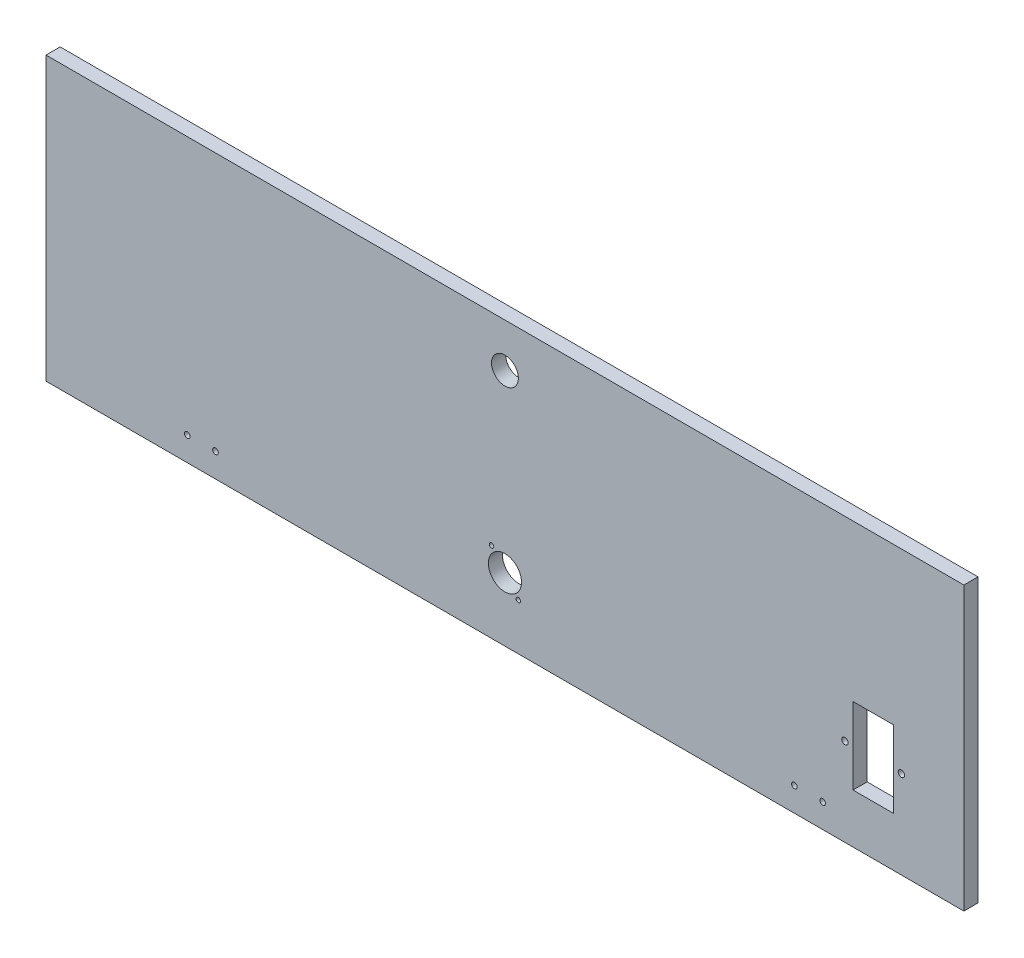
ISO-10303-21;
HEADER;
FILE_DESCRIPTION(('STEP AP214'),'2;1');
FILE_NAME('part.step','',(''),(''),'','','');
FILE_SCHEMA(('AUTOMOTIVE_DESIGN { 1 0 10303 214 1 1 1 1 }'));
ENDSEC;
DATA;
#1=APPLICATION_CONTEXT('core data for automotive mechanical design processes');
#2=APPLICATION_PROTOCOL_DEFINITION('international standard','automotive_design',2000,#1);
#3=PRODUCT_CONTEXT('',#1,'mechanical');
#4=PRODUCT('Part','Part','',(#3));
#5=PRODUCT_RELATED_PRODUCT_CATEGORY('part','',(#4));
#6=PRODUCT_DEFINITION_FORMATION('','',#4);
#7=PRODUCT_DEFINITION_CONTEXT('part definition',#1,'design');
#8=PRODUCT_DEFINITION('design','',#6,#7);
#9=PRODUCT_DEFINITION_SHAPE('','',#8);
#10=(LENGTH_UNIT() NAMED_UNIT(*) SI_UNIT(.MILLI.,.METRE.));
#11=(NAMED_UNIT(*) PLANE_ANGLE_UNIT() SI_UNIT($,.RADIAN.));
#12=(NAMED_UNIT(*) SI_UNIT($,.STERADIAN.) SOLID_ANGLE_UNIT());
#13=UNCERTAINTY_MEASURE_WITH_UNIT(LENGTH_MEASURE(1.E-05),#10,'distance_accuracy_value','');
#14=(GEOMETRIC_REPRESENTATION_CONTEXT(3) GLOBAL_UNCERTAINTY_ASSIGNED_CONTEXT((#13)) GLOBAL_UNIT_ASSIGNED_CONTEXT((#10,
#11,#12)) REPRESENTATION_CONTEXT('',''));
#15=CARTESIAN_POINT('',(0.,0.,0.));
#16=DIRECTION('',(0.,0.,1.));
#17=DIRECTION('',(1.,0.,0.));
#18=AXIS2_PLACEMENT_3D('',#15,#16,#17);
#19=CARTESIAN_POINT('',(0.,0.,10.));
#20=DIRECTION('',(1.,0.,0.));
#21=DIRECTION('',(0.,0.,-1.));
#22=AXIS2_PLACEMENT_3D('',#19,#20,#21);
#23=PLANE('',#22);
#24=DIRECTION('',(0.,-1.,0.));
#25=VECTOR('',#24,1.);
#26=CARTESIAN_POINT('',(0.,0.,0.));
#27=LINE('',#26,#25);
#28=CARTESIAN_POINT('',(0.,200.,0.));
#29=VERTEX_POINT('',#28);
#30=CARTESIAN_POINT('',(0.,0.,0.));
#31=VERTEX_POINT('',#30);
#32=EDGE_CURVE('E177',#29,#31,#27,.T.);
#33=ORIENTED_EDGE('',*,*,#32,.T.);
#34=DIRECTION('',(0.,0.,-1.));
#35=VECTOR('',#34,1.);
#36=CARTESIAN_POINT('',(0.,0.,10.));
#37=LINE('',#36,#35);
#38=CARTESIAN_POINT('',(0.,0.,10.));
#39=VERTEX_POINT('',#38);
#40=EDGE_CURVE('E12',#39,#31,#37,.T.);
#41=ORIENTED_EDGE('',*,*,#40,.F.);
#42=DIRECTION('',(0.,-1.,0.));
#43=VECTOR('',#42,1.);
#44=CARTESIAN_POINT('',(0.,0.,10.));
#45=LINE('',#44,#43);
#46=CARTESIAN_POINT('',(0.,200.,10.));
#47=VERTEX_POINT('',#46);
#48=EDGE_CURVE('E180',#47,#39,#45,.T.);
#49=ORIENTED_EDGE('',*,*,#48,.F.);
#50=DIRECTION('',(0.,0.,-1.));
#51=VECTOR('',#50,1.);
#52=CARTESIAN_POINT('',(0.,200.,10.));
#53=LINE('',#52,#51);
#54=EDGE_CURVE('E190',#47,#29,#53,.T.);
#55=ORIENTED_EDGE('',*,*,#54,.T.);
#56=EDGE_LOOP('',(#33,#41,#49,#55));
#57=FACE_BOUND('',#56,.T.);
#58=ADVANCED_FACE('F45',(#57),#23,.F.);
#59=CARTESIAN_POINT('',(0.,0.,10.));
#60=DIRECTION('',(0.,1.,0.));
#61=DIRECTION('',(0.,0.,1.));
#62=AXIS2_PLACEMENT_3D('',#59,#60,#61);
#63=PLANE('',#62);
#64=DIRECTION('',(1.,0.,0.));
#65=VECTOR('',#64,1.);
#66=CARTESIAN_POINT('',(0.,0.,0.));
#67=LINE('',#66,#65);
#68=CARTESIAN_POINT('',(650.,0.,0.));
#69=VERTEX_POINT('',#68);
#70=EDGE_CURVE('E193',#31,#69,#67,.T.);
#71=ORIENTED_EDGE('',*,*,#70,.T.);
#72=DIRECTION('',(0.,0.,-1.));
#73=VECTOR('',#72,1.);
#74=CARTESIAN_POINT('',(650.,0.,10.));
#75=LINE('',#74,#73);
#76=CARTESIAN_POINT('',(650.,0.,10.));
#77=VERTEX_POINT('',#76);
#78=EDGE_CURVE('E52',#77,#69,#75,.T.);
#79=ORIENTED_EDGE('',*,*,#78,.F.);
#80=DIRECTION('',(1.,0.,0.));
#81=VECTOR('',#80,1.);
#82=CARTESIAN_POINT('',(0.,0.,10.));
#83=LINE('',#82,#81);
#84=EDGE_CURVE('E183',#39,#77,#83,.T.);
#85=ORIENTED_EDGE('',*,*,#84,.F.);
#86=ORIENTED_EDGE('',*,*,#40,.T.);
#87=EDGE_LOOP('',(#71,#79,#85,#86));
#88=FACE_BOUND('',#87,.T.);
#89=ADVANCED_FACE('F222',(#88),#63,.F.);
#90=CARTESIAN_POINT('',(650.,0.,10.));
#91=DIRECTION('',(-1.,0.,0.));
#92=DIRECTION('',(0.,0.,1.));
#93=AXIS2_PLACEMENT_3D('',#90,#91,#92);
#94=PLANE('',#93);
#95=DIRECTION('',(0.,1.,0.));
#96=VECTOR('',#95,1.);
#97=CARTESIAN_POINT('',(650.,0.,0.));
#98=LINE('',#97,#96);
#99=CARTESIAN_POINT('',(650.,200.,0.));
#100=VERTEX_POINT('',#99);
#101=EDGE_CURVE('E195',#69,#100,#98,.T.);
#102=ORIENTED_EDGE('',*,*,#101,.T.);
#103=DIRECTION('',(0.,0.,-1.));
#104=VECTOR('',#103,1.);
#105=CARTESIAN_POINT('',(650.,200.,10.));
#106=LINE('',#105,#104);
#107=CARTESIAN_POINT('',(650.,200.,10.));
#108=VERTEX_POINT('',#107);
#109=EDGE_CURVE('E200',#108,#100,#106,.T.);
#110=ORIENTED_EDGE('',*,*,#109,.F.);
#111=DIRECTION('',(0.,1.,0.));
#112=VECTOR('',#111,1.);
#113=CARTESIAN_POINT('',(650.,0.,10.));
#114=LINE('',#113,#112);
#115=EDGE_CURVE('E186',#77,#108,#114,.T.);
#116=ORIENTED_EDGE('',*,*,#115,.F.);
#117=ORIENTED_EDGE('',*,*,#78,.T.);
#118=EDGE_LOOP('',(#102,#110,#116,#117));
#119=FACE_BOUND('',#118,.T.);
#120=ADVANCED_FACE('F207',(#119),#94,.F.);
#121=CARTESIAN_POINT('',(0.,200.,10.));
#122=DIRECTION('',(0.,-1.,0.));
#123=DIRECTION('',(0.,0.,-1.));
#124=AXIS2_PLACEMENT_3D('',#121,#122,#123);
#125=PLANE('',#124);
#126=DIRECTION('',(-1.,0.,0.));
#127=VECTOR('',#126,1.);
#128=CARTESIAN_POINT('',(0.,200.,0.));
#129=LINE('',#128,#127);
#130=EDGE_CURVE('E184',#100,#29,#129,.T.);
#131=ORIENTED_EDGE('',*,*,#130,.T.);
#132=ORIENTED_EDGE('',*,*,#54,.F.);
#133=DIRECTION('',(-1.,0.,0.));
#134=VECTOR('',#133,1.);
#135=CARTESIAN_POINT('',(0.,200.,10.));
#136=LINE('',#135,#134);
#137=EDGE_CURVE('E188',#108,#47,#136,.T.);
#138=ORIENTED_EDGE('',*,*,#137,.F.);
#139=ORIENTED_EDGE('',*,*,#109,.T.);
#140=EDGE_LOOP('',(#131,#132,#138,#139));
#141=FACE_BOUND('',#140,.T.);
#142=ADVANCED_FACE('F216',(#141),#125,.F.);
#143=CARTESIAN_POINT('',(0.,0.,10.));
#144=DIRECTION('',(0.,0.,-1.));
#145=DIRECTION('',(-1.,0.,0.));
#146=AXIS2_PLACEMENT_3D('',#143,#144,#145);
#147=PLANE('',#146);
#148=CARTESIAN_POINT('',(325.,169.,10.));
#149=DIRECTION('',(0.,0.,1.));
#150=DIRECTION('',(1.,0.,0.));
#151=AXIS2_PLACEMENT_3D('',#148,#149,#150);
#152=CIRCLE('',#151,9.50000000000001);
#153=CARTESIAN_POINT('',(334.5,169.,10.));
#154=VERTEX_POINT('',#153);
#155=EDGE_CURVE('E374',#154,#154,#152,.T.);
#156=ORIENTED_EDGE('',*,*,#155,.F.);
#157=EDGE_LOOP('',(#156));
#158=FACE_BOUND('',#157,.T.);
#159=CARTESIAN_POINT('',(315.499614793712,56.9994043990588,10.));
#160=DIRECTION('',(0.,0.,1.));
#161=DIRECTION('',(1.,0.,0.));
#162=AXIS2_PLACEMENT_3D('',#159,#160,#161);
#163=CIRCLE('',#162,1.59999999999996);
#164=CARTESIAN_POINT('',(317.099614793712,56.9994043990588,10.));
#165=VERTEX_POINT('',#164);
#166=EDGE_CURVE('E155',#165,#165,#163,.T.);
#167=ORIENTED_EDGE('',*,*,#166,.F.);
#168=EDGE_LOOP('',(#167));
#169=FACE_BOUND('',#168,.T.);
#170=CARTESIAN_POINT('',(334.500385206288,33.0005956009415,10.));
#171=DIRECTION('',(0.,0.,1.));
#172=DIRECTION('',(1.,0.,0.));
#173=AXIS2_PLACEMENT_3D('',#170,#171,#172);
#174=CIRCLE('',#173,1.59999999999982);
#175=CARTESIAN_POINT('',(336.100385206288,33.0005956009415,10.));
#176=VERTEX_POINT('',#175);
#177=EDGE_CURVE('E134',#176,#176,#174,.T.);
#178=ORIENTED_EDGE('',*,*,#177,.F.);
#179=EDGE_LOOP('',(#178));
#180=FACE_BOUND('',#179,.T.);
#181=CARTESIAN_POINT('',(605.75,62.15,10.));
#182=DIRECTION('',(0.,0.,1.));
#183=DIRECTION('',(1.,0.,0.));
#184=AXIS2_PLACEMENT_3D('',#181,#182,#183);
#185=CIRCLE('',#184,2.25000000000001);
#186=CARTESIAN_POINT('',(608.,62.15,10.));
#187=VERTEX_POINT('',#186);
#188=EDGE_CURVE('E395',#187,#187,#185,.T.);
#189=ORIENTED_EDGE('',*,*,#188,.F.);
#190=EDGE_LOOP('',(#189));
#191=FACE_BOUND('',#190,.T.);
#192=CARTESIAN_POINT('',(565.75,62.15,10.));
#193=DIRECTION('',(0.,0.,1.));
#194=DIRECTION('',(1.,0.,0.));
#195=AXIS2_PLACEMENT_3D('',#192,#193,#194);
#196=CIRCLE('',#195,2.25000000000001);
#197=CARTESIAN_POINT('',(568.,62.15,10.));
#198=VERTEX_POINT('',#197);
#199=EDGE_CURVE('E116',#198,#198,#196,.T.);
#200=ORIENTED_EDGE('',*,*,#199,.F.);
#201=EDGE_LOOP('',(#200));
#202=FACE_BOUND('',#201,.T.);
#203=DIRECTION('',(0.,1.,0.));
#204=VECTOR('',#203,1.);
#205=CARTESIAN_POINT('',(600.,0.,10.));
#206=LINE('',#205,#204);
#207=CARTESIAN_POINT('',(600.,35.,10.));
#208=VERTEX_POINT('',#207);
#209=CARTESIAN_POINT('',(600.,89.3,10.));
#210=VERTEX_POINT('',#209);
#211=EDGE_CURVE('E130',#208,#210,#206,.T.);
#212=ORIENTED_EDGE('',*,*,#211,.F.);
#213=DIRECTION('',(1.,0.,0.));
#214=VECTOR('',#213,1.);
#215=CARTESIAN_POINT('',(0.,35.,10.));
#216=LINE('',#215,#214);
#217=CARTESIAN_POINT('',(571.5,35.,10.));
#218=VERTEX_POINT('',#217);
#219=EDGE_CURVE('E59',#218,#208,#216,.T.);
#220=ORIENTED_EDGE('',*,*,#219,.F.);
#221=DIRECTION('',(0.,1.,0.));
#222=VECTOR('',#221,1.);
#223=CARTESIAN_POINT('',(571.5,0.,10.));
#224=LINE('',#223,#222);
#225=CARTESIAN_POINT('',(571.5,89.3,10.));
#226=VERTEX_POINT('',#225);
#227=EDGE_CURVE('E119',#218,#226,#224,.T.);
#228=ORIENTED_EDGE('',*,*,#227,.T.);
#229=DIRECTION('',(1.,0.,0.));
#230=VECTOR('',#229,1.);
#231=CARTESIAN_POINT('',(0.,89.3,10.));
#232=LINE('',#231,#230);
#233=EDGE_CURVE('E125',#226,#210,#232,.T.);
#234=ORIENTED_EDGE('',*,*,#233,.T.);
#235=EDGE_LOOP('',(#212,#220,#228,#234));
#236=FACE_BOUND('',#235,.T.);
#237=CARTESIAN_POINT('',(325.,45.,10.));
#238=DIRECTION('',(0.,0.,1.));
#239=DIRECTION('',(1.,0.,0.));
#240=AXIS2_PLACEMENT_3D('',#237,#238,#239);
#241=CIRCLE('',#240,11.75);
#242=CARTESIAN_POINT('',(336.75,45.,10.));
#243=VERTEX_POINT('',#242);
#244=EDGE_CURVE('E152',#243,#243,#241,.T.);
#245=ORIENTED_EDGE('',*,*,#244,.F.);
#246=EDGE_LOOP('',(#245));
#247=FACE_BOUND('',#246,.T.);
#248=CARTESIAN_POINT('',(120.,17.,10.));
#249=DIRECTION('',(0.,0.,1.));
#250=DIRECTION('',(1.,0.,0.));
#251=AXIS2_PLACEMENT_3D('',#248,#249,#250);
#252=CIRCLE('',#251,2.);
#253=CARTESIAN_POINT('',(122.,17.,10.));
#254=VERTEX_POINT('',#253);
#255=EDGE_CURVE('E160',#254,#254,#252,.T.);
#256=ORIENTED_EDGE('',*,*,#255,.F.);
#257=EDGE_LOOP('',(#256));
#258=FACE_BOUND('',#257,.T.);
#259=CARTESIAN_POINT('',(530.,17.,10.));
#260=DIRECTION('',(0.,0.,1.));
#261=DIRECTION('',(1.,0.,0.));
#262=AXIS2_PLACEMENT_3D('',#259,#260,#261);
#263=CIRCLE('',#262,2.);
#264=CARTESIAN_POINT('',(532.,17.,10.));
#265=VERTEX_POINT('',#264);
#266=EDGE_CURVE('E166',#265,#265,#263,.T.);
#267=ORIENTED_EDGE('',*,*,#266,.F.);
#268=EDGE_LOOP('',(#267));
#269=FACE_BOUND('',#268,.T.);
#270=CARTESIAN_POINT('',(550.,17.,10.));
#271=DIRECTION('',(0.,0.,1.));
#272=DIRECTION('',(1.,0.,0.));
#273=AXIS2_PLACEMENT_3D('',#270,#271,#272);
#274=CIRCLE('',#273,2.);
#275=CARTESIAN_POINT('',(552.,17.,10.));
#276=VERTEX_POINT('',#275);
#277=EDGE_CURVE('E151',#276,#276,#274,.T.);
#278=ORIENTED_EDGE('',*,*,#277,.F.);
#279=EDGE_LOOP('',(#278));
#280=FACE_BOUND('',#279,.T.);
#281=CARTESIAN_POINT('',(100.,17.,10.));
#282=DIRECTION('',(0.,0.,1.));
#283=DIRECTION('',(1.,0.,0.));
#284=AXIS2_PLACEMENT_3D('',#281,#282,#283);
#285=CIRCLE('',#284,2.);
#286=CARTESIAN_POINT('',(102.,17.,10.));
#287=VERTEX_POINT('',#286);
#288=EDGE_CURVE('E159',#287,#287,#285,.T.);
#289=ORIENTED_EDGE('',*,*,#288,.F.);
#290=EDGE_LOOP('',(#289));
#291=FACE_BOUND('',#290,.T.);
#292=ORIENTED_EDGE('',*,*,#48,.T.);
#293=ORIENTED_EDGE('',*,*,#84,.T.);
#294=ORIENTED_EDGE('',*,*,#115,.T.);
#295=ORIENTED_EDGE('',*,*,#137,.T.);
#296=EDGE_LOOP('',(#292,#293,#294,#295));
#297=FACE_BOUND('',#296,.T.);
#298=ADVANCED_FACE('F128',(#158,#169,#180,#191,#202,#236,#247,#258,#269,#280,#291,#297),#147,.F.);
#299=CARTESIAN_POINT('',(0.,0.,0.));
#300=DIRECTION('',(0.,0.,-1.));
#301=DIRECTION('',(-1.,0.,0.));
#302=AXIS2_PLACEMENT_3D('',#299,#300,#301);
#303=PLANE('',#302);
#304=CARTESIAN_POINT('',(525.,193.,0.));
#305=DIRECTION('',(0.,0.,1.));
#306=DIRECTION('',(1.,0.,0.));
#307=AXIS2_PLACEMENT_3D('',#304,#305,#306);
#308=CIRCLE('',#307,1.00000000000006);
#309=CARTESIAN_POINT('',(526.,193.,0.));
#310=VERTEX_POINT('',#309);
#311=EDGE_CURVE('E359',#310,#310,#308,.T.);
#312=ORIENTED_EDGE('',*,*,#311,.T.);
#313=EDGE_LOOP('',(#312));
#314=FACE_BOUND('',#313,.T.);
#315=CARTESIAN_POINT('',(545.,193.,0.));
#316=DIRECTION('',(0.,0.,1.));
#317=DIRECTION('',(1.,0.,0.));
#318=AXIS2_PLACEMENT_3D('',#315,#316,#317);
#319=CIRCLE('',#318,1.00000000000005);
#320=CARTESIAN_POINT('',(546.,193.,0.));
#321=VERTEX_POINT('',#320);
#322=EDGE_CURVE('E353',#321,#321,#319,.T.);
#323=ORIENTED_EDGE('',*,*,#322,.T.);
#324=EDGE_LOOP('',(#323));
#325=FACE_BOUND('',#324,.T.);
#326=CARTESIAN_POINT('',(105.,193.,0.));
#327=DIRECTION('',(0.,0.,1.));
#328=DIRECTION('',(1.,0.,0.));
#329=AXIS2_PLACEMENT_3D('',#326,#327,#328);
#330=CIRCLE('',#329,0.999999999999998);
#331=CARTESIAN_POINT('',(106.,193.,0.));
#332=VERTEX_POINT('',#331);
#333=EDGE_CURVE('E342',#332,#332,#330,.T.);
#334=ORIENTED_EDGE('',*,*,#333,.T.);
#335=EDGE_LOOP('',(#334));
#336=FACE_BOUND('',#335,.T.);
#337=CARTESIAN_POINT('',(125.,193.,0.));
#338=DIRECTION('',(0.,0.,1.));
#339=DIRECTION('',(1.,0.,0.));
#340=AXIS2_PLACEMENT_3D('',#337,#338,#339);
#341=CIRCLE('',#340,0.999999999999972);
#342=CARTESIAN_POINT('',(126.,193.,0.));
#343=VERTEX_POINT('',#342);
#344=EDGE_CURVE('E341',#343,#343,#341,.T.);
#345=ORIENTED_EDGE('',*,*,#344,.T.);
#346=EDGE_LOOP('',(#345));
#347=FACE_BOUND('',#346,.T.);
#348=CARTESIAN_POINT('',(309.,169.,0.));
#349=DIRECTION('',(0.,0.,1.));
#350=DIRECTION('',(1.,0.,0.));
#351=AXIS2_PLACEMENT_3D('',#348,#349,#350);
#352=CIRCLE('',#351,0.999999999999998);
#353=CARTESIAN_POINT('',(310.,169.,0.));
#354=VERTEX_POINT('',#353);
#355=EDGE_CURVE('E366',#354,#354,#352,.T.);
#356=ORIENTED_EDGE('',*,*,#355,.T.);
#357=EDGE_LOOP('',(#356));
#358=FACE_BOUND('',#357,.T.);
#359=CARTESIAN_POINT('',(341.,169.,0.));
#360=DIRECTION('',(0.,0.,1.));
#361=DIRECTION('',(1.,0.,0.));
#362=AXIS2_PLACEMENT_3D('',#359,#360,#361);
#363=CIRCLE('',#362,0.999999999999998);
#364=CARTESIAN_POINT('',(342.,169.,0.));
#365=VERTEX_POINT('',#364);
#366=EDGE_CURVE('E365',#365,#365,#363,.T.);
#367=ORIENTED_EDGE('',*,*,#366,.T.);
#368=EDGE_LOOP('',(#367));
#369=FACE_BOUND('',#368,.T.);
#370=CARTESIAN_POINT('',(325.,169.,0.));
#371=DIRECTION('',(0.,0.,1.));
#372=DIRECTION('',(1.,0.,0.));
#373=AXIS2_PLACEMENT_3D('',#370,#371,#372);
#374=CIRCLE('',#373,9.50000000000001);
#375=CARTESIAN_POINT('',(334.5,169.,0.));
#376=VERTEX_POINT('',#375);
#377=EDGE_CURVE('E377',#376,#376,#374,.T.);
#378=ORIENTED_EDGE('',*,*,#377,.T.);
#379=EDGE_LOOP('',(#378));
#380=FACE_BOUND('',#379,.T.);
#381=CARTESIAN_POINT('',(315.499614793712,56.9994043990588,0.));
#382=DIRECTION('',(0.,0.,1.));
#383=DIRECTION('',(1.,0.,0.));
#384=AXIS2_PLACEMENT_3D('',#381,#382,#383);
#385=CIRCLE('',#384,1.59999999999996);
#386=CARTESIAN_POINT('',(317.099614793712,56.9994043990588,0.));
#387=VERTEX_POINT('',#386);
#388=EDGE_CURVE('E385',#387,#387,#385,.T.);
#389=ORIENTED_EDGE('',*,*,#388,.T.);
#390=EDGE_LOOP('',(#389));
#391=FACE_BOUND('',#390,.T.);
#392=CARTESIAN_POINT('',(334.500385206288,33.0005956009415,0.));
#393=DIRECTION('',(0.,0.,1.));
#394=DIRECTION('',(1.,0.,0.));
#395=AXIS2_PLACEMENT_3D('',#392,#393,#394);
#396=CIRCLE('',#395,1.59999999999982);
#397=CARTESIAN_POINT('',(336.100385206288,33.0005956009415,0.));
#398=VERTEX_POINT('',#397);
#399=EDGE_CURVE('E131',#398,#398,#396,.T.);
#400=ORIENTED_EDGE('',*,*,#399,.T.);
#401=EDGE_LOOP('',(#400));
#402=FACE_BOUND('',#401,.T.);
#403=CARTESIAN_POINT('',(605.75,62.15,0.));
#404=DIRECTION('',(0.,0.,1.));
#405=DIRECTION('',(1.,0.,0.));
#406=AXIS2_PLACEMENT_3D('',#403,#404,#405);
#407=CIRCLE('',#406,2.25000000000001);
#408=CARTESIAN_POINT('',(608.,62.15,0.));
#409=VERTEX_POINT('',#408);
#410=EDGE_CURVE('E380',#409,#409,#407,.T.);
#411=ORIENTED_EDGE('',*,*,#410,.T.);
#412=EDGE_LOOP('',(#411));
#413=FACE_BOUND('',#412,.T.);
#414=CARTESIAN_POINT('',(565.75,62.15,0.));
#415=DIRECTION('',(0.,0.,1.));
#416=DIRECTION('',(1.,0.,0.));
#417=AXIS2_PLACEMENT_3D('',#414,#415,#416);
#418=CIRCLE('',#417,2.25000000000001);
#419=CARTESIAN_POINT('',(568.,62.15,0.));
#420=VERTEX_POINT('',#419);
#421=EDGE_CURVE('E392',#420,#420,#418,.T.);
#422=ORIENTED_EDGE('',*,*,#421,.T.);
#423=EDGE_LOOP('',(#422));
#424=FACE_BOUND('',#423,.T.);
#425=DIRECTION('',(1.,0.,0.));
#426=VECTOR('',#425,1.);
#427=CARTESIAN_POINT('',(0.,35.,0.));
#428=LINE('',#427,#426);
#429=CARTESIAN_POINT('',(571.5,35.,0.));
#430=VERTEX_POINT('',#429);
#431=CARTESIAN_POINT('',(600.,35.,0.));
#432=VERTEX_POINT('',#431);
#433=EDGE_CURVE('E112',#430,#432,#428,.T.);
#434=ORIENTED_EDGE('',*,*,#433,.T.);
#435=DIRECTION('',(0.,1.,0.));
#436=VECTOR('',#435,1.);
#437=CARTESIAN_POINT('',(600.,0.,0.));
#438=LINE('',#437,#436);
#439=CARTESIAN_POINT('',(600.,89.3,0.));
#440=VERTEX_POINT('',#439);
#441=EDGE_CURVE('E144',#432,#440,#438,.T.);
#442=ORIENTED_EDGE('',*,*,#441,.T.);
#443=DIRECTION('',(1.,0.,0.));
#444=VECTOR('',#443,1.);
#445=CARTESIAN_POINT('',(0.,89.3,0.));
#446=LINE('',#445,#444);
#447=CARTESIAN_POINT('',(571.5,89.3,0.));
#448=VERTEX_POINT('',#447);
#449=EDGE_CURVE('E141',#448,#440,#446,.T.);
#450=ORIENTED_EDGE('',*,*,#449,.F.);
#451=DIRECTION('',(0.,1.,0.));
#452=VECTOR('',#451,1.);
#453=CARTESIAN_POINT('',(571.5,0.,0.));
#454=LINE('',#453,#452);
#455=EDGE_CURVE('E139',#430,#448,#454,.T.);
#456=ORIENTED_EDGE('',*,*,#455,.F.);
#457=EDGE_LOOP('',(#434,#442,#450,#456));
#458=FACE_BOUND('',#457,.T.);
#459=CARTESIAN_POINT('',(325.,45.,0.));
#460=DIRECTION('',(0.,0.,1.));
#461=DIRECTION('',(1.,0.,0.));
#462=AXIS2_PLACEMENT_3D('',#459,#460,#461);
#463=CIRCLE('',#462,11.75);
#464=CARTESIAN_POINT('',(336.75,45.,0.));
#465=VERTEX_POINT('',#464);
#466=EDGE_CURVE('E148',#465,#465,#463,.T.);
#467=ORIENTED_EDGE('',*,*,#466,.T.);
#468=EDGE_LOOP('',(#467));
#469=FACE_BOUND('',#468,.T.);
#470=CARTESIAN_POINT('',(120.,17.,0.));
#471=DIRECTION('',(0.,0.,1.));
#472=DIRECTION('',(1.,0.,0.));
#473=AXIS2_PLACEMENT_3D('',#470,#471,#472);
#474=CIRCLE('',#473,2.);
#475=CARTESIAN_POINT('',(122.,17.,0.));
#476=VERTEX_POINT('',#475);
#477=EDGE_CURVE('E156',#476,#476,#474,.T.);
#478=ORIENTED_EDGE('',*,*,#477,.T.);
#479=EDGE_LOOP('',(#478));
#480=FACE_BOUND('',#479,.T.);
#481=CARTESIAN_POINT('',(530.,17.,0.));
#482=DIRECTION('',(0.,0.,1.));
#483=DIRECTION('',(1.,0.,0.));
#484=AXIS2_PLACEMENT_3D('',#481,#482,#483);
#485=CIRCLE('',#484,2.);
#486=CARTESIAN_POINT('',(532.,17.,0.));
#487=VERTEX_POINT('',#486);
#488=EDGE_CURVE('E163',#487,#487,#485,.T.);
#489=ORIENTED_EDGE('',*,*,#488,.T.);
#490=EDGE_LOOP('',(#489));
#491=FACE_BOUND('',#490,.T.);
#492=CARTESIAN_POINT('',(550.,17.,0.));
#493=DIRECTION('',(0.,0.,1.));
#494=DIRECTION('',(1.,0.,0.));
#495=AXIS2_PLACEMENT_3D('',#492,#493,#494);
#496=CIRCLE('',#495,2.);
#497=CARTESIAN_POINT('',(552.,17.,0.));
#498=VERTEX_POINT('',#497);
#499=EDGE_CURVE('E169',#498,#498,#496,.T.);
#500=ORIENTED_EDGE('',*,*,#499,.T.);
#501=EDGE_LOOP('',(#500));
#502=FACE_BOUND('',#501,.T.);
#503=CARTESIAN_POINT('',(100.,17.,0.));
#504=DIRECTION('',(0.,0.,1.));
#505=DIRECTION('',(1.,0.,0.));
#506=AXIS2_PLACEMENT_3D('',#503,#504,#505);
#507=CIRCLE('',#506,2.);
#508=CARTESIAN_POINT('',(102.,17.,0.));
#509=VERTEX_POINT('',#508);
#510=EDGE_CURVE('E174',#509,#509,#507,.T.);
#511=ORIENTED_EDGE('',*,*,#510,.T.);
#512=EDGE_LOOP('',(#511));
#513=FACE_BOUND('',#512,.T.);
#514=ORIENTED_EDGE('',*,*,#32,.F.);
#515=ORIENTED_EDGE('',*,*,#130,.F.);
#516=ORIENTED_EDGE('',*,*,#101,.F.);
#517=ORIENTED_EDGE('',*,*,#70,.F.);
#518=EDGE_LOOP('',(#514,#515,#516,#517));
#519=FACE_BOUND('',#518,.T.);
#520=ADVANCED_FACE('F213',(#314,#325,#336,#347,#358,#369,#380,#391,#402,#413,#424,#458,#469,
#480,#491,#502,#513,#519),#303,.T.);
#521=CARTESIAN_POINT('',(100.,17.,0.));
#522=DIRECTION('',(0.,0.,1.));
#523=DIRECTION('',(1.,0.,0.));
#524=AXIS2_PLACEMENT_3D('',#521,#522,#523);
#525=CYLINDRICAL_SURFACE('',#524,2.);
#526=ORIENTED_EDGE('',*,*,#510,.F.);
#527=EDGE_LOOP('',(#526));
#528=FACE_BOUND('',#527,.T.);
#529=ORIENTED_EDGE('',*,*,#288,.T.);
#530=EDGE_LOOP('',(#529));
#531=FACE_BOUND('',#530,.T.);
#532=ADVANCED_FACE('F234',(#528,#531),#525,.F.);
#533=CARTESIAN_POINT('',(550.,17.,0.));
#534=DIRECTION('',(0.,0.,1.));
#535=DIRECTION('',(1.,0.,0.));
#536=AXIS2_PLACEMENT_3D('',#533,#534,#535);
#537=CYLINDRICAL_SURFACE('',#536,2.);
#538=ORIENTED_EDGE('',*,*,#499,.F.);
#539=EDGE_LOOP('',(#538));
#540=FACE_BOUND('',#539,.T.);
#541=ORIENTED_EDGE('',*,*,#277,.T.);
#542=EDGE_LOOP('',(#541));
#543=FACE_BOUND('',#542,.T.);
#544=ADVANCED_FACE('F241',(#540,#543),#537,.F.);
#545=CARTESIAN_POINT('',(530.,17.,0.));
#546=DIRECTION('',(0.,0.,1.));
#547=DIRECTION('',(1.,0.,0.));
#548=AXIS2_PLACEMENT_3D('',#545,#546,#547);
#549=CYLINDRICAL_SURFACE('',#548,2.);
#550=ORIENTED_EDGE('',*,*,#488,.F.);
#551=EDGE_LOOP('',(#550));
#552=FACE_BOUND('',#551,.T.);
#553=ORIENTED_EDGE('',*,*,#266,.T.);
#554=EDGE_LOOP('',(#553));
#555=FACE_BOUND('',#554,.T.);
#556=ADVANCED_FACE('F245',(#552,#555),#549,.F.);
#557=CARTESIAN_POINT('',(120.,17.,0.));
#558=DIRECTION('',(0.,0.,1.));
#559=DIRECTION('',(1.,0.,0.));
#560=AXIS2_PLACEMENT_3D('',#557,#558,#559);
#561=CYLINDRICAL_SURFACE('',#560,2.);
#562=ORIENTED_EDGE('',*,*,#477,.F.);
#563=EDGE_LOOP('',(#562));
#564=FACE_BOUND('',#563,.T.);
#565=ORIENTED_EDGE('',*,*,#255,.T.);
#566=EDGE_LOOP('',(#565));
#567=FACE_BOUND('',#566,.T.);
#568=ADVANCED_FACE('F249',(#564,#567),#561,.F.);
#569=CARTESIAN_POINT('',(325.,45.,0.));
#570=DIRECTION('',(0.,0.,1.));
#571=DIRECTION('',(1.,0.,0.));
#572=AXIS2_PLACEMENT_3D('',#569,#570,#571);
#573=CYLINDRICAL_SURFACE('',#572,11.75);
#574=ORIENTED_EDGE('',*,*,#466,.F.);
#575=EDGE_LOOP('',(#574));
#576=FACE_BOUND('',#575,.T.);
#577=ORIENTED_EDGE('',*,*,#244,.T.);
#578=EDGE_LOOP('',(#577));
#579=FACE_BOUND('',#578,.T.);
#580=ADVANCED_FACE('F253',(#576,#579),#573,.F.);
#581=CARTESIAN_POINT('',(0.,35.,0.));
#582=DIRECTION('',(0.,-1.,0.));
#583=DIRECTION('',(0.,0.,-1.));
#584=AXIS2_PLACEMENT_3D('',#581,#582,#583);
#585=PLANE('',#584);
#586=ORIENTED_EDGE('',*,*,#219,.T.);
#587=DIRECTION('',(0.,0.,1.));
#588=VECTOR('',#587,1.);
#589=CARTESIAN_POINT('',(600.,35.,0.));
#590=LINE('',#589,#588);
#591=EDGE_CURVE('E142',#432,#208,#590,.T.);
#592=ORIENTED_EDGE('',*,*,#591,.F.);
#593=ORIENTED_EDGE('',*,*,#433,.F.);
#594=DIRECTION('',(0.,0.,1.));
#595=VECTOR('',#594,1.);
#596=CARTESIAN_POINT('',(571.5,35.,0.));
#597=LINE('',#596,#595);
#598=EDGE_CURVE('E108',#430,#218,#597,.T.);
#599=ORIENTED_EDGE('',*,*,#598,.T.);
#600=EDGE_LOOP('',(#586,#592,#593,#599));
#601=FACE_BOUND('',#600,.T.);
#602=ADVANCED_FACE('F110',(#601),#585,.F.);
#603=CARTESIAN_POINT('',(571.5,0.,0.));
#604=DIRECTION('',(1.,0.,0.));
#605=DIRECTION('',(0.,0.,-1.));
#606=AXIS2_PLACEMENT_3D('',#603,#604,#605);
#607=PLANE('',#606);
#608=ORIENTED_EDGE('',*,*,#227,.F.);
#609=ORIENTED_EDGE('',*,*,#598,.F.);
#610=ORIENTED_EDGE('',*,*,#455,.T.);
#611=DIRECTION('',(0.,0.,1.));
#612=VECTOR('',#611,1.);
#613=CARTESIAN_POINT('',(571.5,89.3,0.));
#614=LINE('',#613,#612);
#615=EDGE_CURVE('E115',#448,#226,#614,.T.);
#616=ORIENTED_EDGE('',*,*,#615,.T.);
#617=EDGE_LOOP('',(#608,#609,#610,#616));
#618=FACE_BOUND('',#617,.T.);
#619=ADVANCED_FACE('F120',(#618),#607,.T.);
#620=CARTESIAN_POINT('',(0.,89.3,0.));
#621=DIRECTION('',(0.,-1.,0.));
#622=DIRECTION('',(0.,0.,-1.));
#623=AXIS2_PLACEMENT_3D('',#620,#621,#622);
#624=PLANE('',#623);
#625=ORIENTED_EDGE('',*,*,#233,.F.);
#626=ORIENTED_EDGE('',*,*,#615,.F.);
#627=ORIENTED_EDGE('',*,*,#449,.T.);
#628=DIRECTION('',(0.,0.,1.));
#629=VECTOR('',#628,1.);
#630=CARTESIAN_POINT('',(600.,89.3,0.));
#631=LINE('',#630,#629);
#632=EDGE_CURVE('E67',#440,#210,#631,.T.);
#633=ORIENTED_EDGE('',*,*,#632,.T.);
#634=EDGE_LOOP('',(#625,#626,#627,#633));
#635=FACE_BOUND('',#634,.T.);
#636=ADVANCED_FACE('F260',(#635),#624,.T.);
#637=CARTESIAN_POINT('',(600.,0.,0.));
#638=DIRECTION('',(1.,0.,0.));
#639=DIRECTION('',(0.,0.,-1.));
#640=AXIS2_PLACEMENT_3D('',#637,#638,#639);
#641=PLANE('',#640);
#642=ORIENTED_EDGE('',*,*,#211,.T.);
#643=ORIENTED_EDGE('',*,*,#632,.F.);
#644=ORIENTED_EDGE('',*,*,#441,.F.);
#645=ORIENTED_EDGE('',*,*,#591,.T.);
#646=EDGE_LOOP('',(#642,#643,#644,#645));
#647=FACE_BOUND('',#646,.T.);
#648=ADVANCED_FACE('F263',(#647),#641,.F.);
#649=CARTESIAN_POINT('',(565.75,62.15,0.));
#650=DIRECTION('',(0.,0.,1.));
#651=DIRECTION('',(1.,0.,0.));
#652=AXIS2_PLACEMENT_3D('',#649,#650,#651);
#653=CYLINDRICAL_SURFACE('',#652,2.25000000000001);
#654=ORIENTED_EDGE('',*,*,#421,.F.);
#655=EDGE_LOOP('',(#654));
#656=FACE_BOUND('',#655,.T.);
#657=ORIENTED_EDGE('',*,*,#199,.T.);
#658=EDGE_LOOP('',(#657));
#659=FACE_BOUND('',#658,.T.);
#660=ADVANCED_FACE('F267',(#656,#659),#653,.F.);
#661=CARTESIAN_POINT('',(605.75,62.15,0.));
#662=DIRECTION('',(0.,0.,1.));
#663=DIRECTION('',(1.,0.,0.));
#664=AXIS2_PLACEMENT_3D('',#661,#662,#663);
#665=CYLINDRICAL_SURFACE('',#664,2.25000000000001);
#666=ORIENTED_EDGE('',*,*,#410,.F.);
#667=EDGE_LOOP('',(#666));
#668=FACE_BOUND('',#667,.T.);
#669=ORIENTED_EDGE('',*,*,#188,.T.);
#670=EDGE_LOOP('',(#669));
#671=FACE_BOUND('',#670,.T.);
#672=ADVANCED_FACE('F270',(#668,#671),#665,.F.);
#673=CARTESIAN_POINT('',(334.500385206288,33.0005956009415,0.));
#674=DIRECTION('',(0.,0.,1.));
#675=DIRECTION('',(1.,0.,0.));
#676=AXIS2_PLACEMENT_3D('',#673,#674,#675);
#677=CYLINDRICAL_SURFACE('',#676,1.59999999999982);
#678=ORIENTED_EDGE('',*,*,#399,.F.);
#679=EDGE_LOOP('',(#678));
#680=FACE_BOUND('',#679,.T.);
#681=ORIENTED_EDGE('',*,*,#177,.T.);
#682=EDGE_LOOP('',(#681));
#683=FACE_BOUND('',#682,.T.);
#684=ADVANCED_FACE('F273',(#680,#683),#677,.F.);
#685=CARTESIAN_POINT('',(315.499614793712,56.9994043990588,0.));
#686=DIRECTION('',(0.,0.,1.));
#687=DIRECTION('',(1.,0.,0.));
#688=AXIS2_PLACEMENT_3D('',#685,#686,#687);
#689=CYLINDRICAL_SURFACE('',#688,1.59999999999996);
#690=ORIENTED_EDGE('',*,*,#388,.F.);
#691=EDGE_LOOP('',(#690));
#692=FACE_BOUND('',#691,.T.);
#693=ORIENTED_EDGE('',*,*,#166,.T.);
#694=EDGE_LOOP('',(#693));
#695=FACE_BOUND('',#694,.T.);
#696=ADVANCED_FACE('F280',(#692,#695),#689,.F.);
#697=CARTESIAN_POINT('',(325.,169.,0.));
#698=DIRECTION('',(0.,0.,1.));
#699=DIRECTION('',(1.,0.,0.));
#700=AXIS2_PLACEMENT_3D('',#697,#698,#699);
#701=CYLINDRICAL_SURFACE('',#700,9.50000000000001);
#702=ORIENTED_EDGE('',*,*,#377,.F.);
#703=EDGE_LOOP('',(#702));
#704=FACE_BOUND('',#703,.T.);
#705=ORIENTED_EDGE('',*,*,#155,.T.);
#706=EDGE_LOOP('',(#705));
#707=FACE_BOUND('',#706,.T.);
#708=ADVANCED_FACE('F284',(#704,#707),#701,.F.);
#709=CARTESIAN_POINT('',(341.,169.,2.));
#710=DIRECTION('',(0.,0.,-1.));
#711=DIRECTION('',(-1.,0.,0.));
#712=AXIS2_PLACEMENT_3D('',#709,#710,#711);
#713=CYLINDRICAL_SURFACE('',#712,0.999999999999998);
#714=CARTESIAN_POINT('',(341.,169.,2.));
#715=DIRECTION('',(0.,0.,1.));
#716=DIRECTION('',(1.,0.,0.));
#717=AXIS2_PLACEMENT_3D('',#714,#715,#716);
#718=CIRCLE('',#717,0.999999999999998);
#719=CARTESIAN_POINT('',(342.,169.,2.));
#720=VERTEX_POINT('',#719);
#721=EDGE_CURVE('E371',#720,#720,#718,.T.);
#722=ORIENTED_EDGE('',*,*,#721,.T.);
#723=EDGE_LOOP('',(#722));
#724=FACE_BOUND('',#723,.T.);
#725=ORIENTED_EDGE('',*,*,#366,.F.);
#726=EDGE_LOOP('',(#725));
#727=FACE_BOUND('',#726,.T.);
#728=ADVANCED_FACE('F288',(#724,#727),#713,.F.);
#729=CARTESIAN_POINT('',(341.,169.,2.));
#730=DIRECTION('',(0.,0.,1.));
#731=DIRECTION('',(1.,0.,0.));
#732=AXIS2_PLACEMENT_3D('',#729,#730,#731);
#733=PLANE('',#732);
#734=ORIENTED_EDGE('',*,*,#721,.F.);
#735=EDGE_LOOP('',(#734));
#736=FACE_BOUND('',#735,.T.);
#737=ADVANCED_FACE('F292',(#736),#733,.F.);
#738=CARTESIAN_POINT('',(309.,169.,2.));
#739=DIRECTION('',(0.,0.,-1.));
#740=DIRECTION('',(-1.,0.,0.));
#741=AXIS2_PLACEMENT_3D('',#738,#739,#740);
#742=CYLINDRICAL_SURFACE('',#741,0.999999999999998);
#743=CARTESIAN_POINT('',(309.,169.,2.));
#744=DIRECTION('',(0.,0.,1.));
#745=DIRECTION('',(1.,0.,0.));
#746=AXIS2_PLACEMENT_3D('',#743,#744,#745);
#747=CIRCLE('',#746,0.999999999999998);
#748=CARTESIAN_POINT('',(310.,169.,2.));
#749=VERTEX_POINT('',#748);
#750=EDGE_CURVE('E362',#749,#749,#747,.T.);
#751=ORIENTED_EDGE('',*,*,#750,.T.);
#752=EDGE_LOOP('',(#751));
#753=FACE_BOUND('',#752,.T.);
#754=ORIENTED_EDGE('',*,*,#355,.F.);
#755=EDGE_LOOP('',(#754));
#756=FACE_BOUND('',#755,.T.);
#757=ADVANCED_FACE('F296',(#753,#756),#742,.F.);
#758=CARTESIAN_POINT('',(309.,169.,2.));
#759=DIRECTION('',(0.,0.,1.));
#760=DIRECTION('',(1.,0.,0.));
#761=AXIS2_PLACEMENT_3D('',#758,#759,#760);
#762=PLANE('',#761);
#763=ORIENTED_EDGE('',*,*,#750,.F.);
#764=EDGE_LOOP('',(#763));
#765=FACE_BOUND('',#764,.T.);
#766=ADVANCED_FACE('F302',(#765),#762,.F.);
#767=CARTESIAN_POINT('',(125.,193.,2.));
#768=DIRECTION('',(0.,0.,-1.));
#769=DIRECTION('',(-1.,0.,0.));
#770=AXIS2_PLACEMENT_3D('',#767,#768,#769);
#771=CYLINDRICAL_SURFACE('',#770,0.999999999999972);
#772=CARTESIAN_POINT('',(125.,193.,2.));
#773=DIRECTION('',(0.,0.,1.));
#774=DIRECTION('',(1.,0.,0.));
#775=AXIS2_PLACEMENT_3D('',#772,#773,#774);
#776=CIRCLE('',#775,0.999999999999972);
#777=CARTESIAN_POINT('',(126.,193.,2.));
#778=VERTEX_POINT('',#777);
#779=EDGE_CURVE('E345',#778,#778,#776,.T.);
#780=ORIENTED_EDGE('',*,*,#779,.T.);
#781=EDGE_LOOP('',(#780));
#782=FACE_BOUND('',#781,.T.);
#783=ORIENTED_EDGE('',*,*,#344,.F.);
#784=EDGE_LOOP('',(#783));
#785=FACE_BOUND('',#784,.T.);
#786=ADVANCED_FACE('F298',(#782,#785),#771,.F.);
#787=CARTESIAN_POINT('',(125.,193.,2.));
#788=DIRECTION('',(0.,0.,1.));
#789=DIRECTION('',(1.,0.,0.));
#790=AXIS2_PLACEMENT_3D('',#787,#788,#789);
#791=PLANE('',#790);
#792=ORIENTED_EDGE('',*,*,#779,.F.);
#793=EDGE_LOOP('',(#792));
#794=FACE_BOUND('',#793,.T.);
#795=ADVANCED_FACE('F301',(#794),#791,.F.);
#796=CARTESIAN_POINT('',(105.,193.,2.));
#797=DIRECTION('',(0.,0.,-1.));
#798=DIRECTION('',(-1.,0.,0.));
#799=AXIS2_PLACEMENT_3D('',#796,#797,#798);
#800=CYLINDRICAL_SURFACE('',#799,0.999999999999998);
#801=CARTESIAN_POINT('',(105.,193.,2.));
#802=DIRECTION('',(0.,0.,1.));
#803=DIRECTION('',(1.,0.,0.));
#804=AXIS2_PLACEMENT_3D('',#801,#802,#803);
#805=CIRCLE('',#804,0.999999999999998);
#806=CARTESIAN_POINT('',(106.,193.,2.));
#807=VERTEX_POINT('',#806);
#808=EDGE_CURVE('E340',#807,#807,#805,.T.);
#809=ORIENTED_EDGE('',*,*,#808,.T.);
#810=EDGE_LOOP('',(#809));
#811=FACE_BOUND('',#810,.T.);
#812=ORIENTED_EDGE('',*,*,#333,.F.);
#813=EDGE_LOOP('',(#812));
#814=FACE_BOUND('',#813,.T.);
#815=ADVANCED_FACE('F306',(#811,#814),#800,.F.);
#816=CARTESIAN_POINT('',(105.,193.,2.));
#817=DIRECTION('',(0.,0.,1.));
#818=DIRECTION('',(1.,0.,0.));
#819=AXIS2_PLACEMENT_3D('',#816,#817,#818);
#820=PLANE('',#819);
#821=ORIENTED_EDGE('',*,*,#808,.F.);
#822=EDGE_LOOP('',(#821));
#823=FACE_BOUND('',#822,.T.);
#824=ADVANCED_FACE('F326',(#823),#820,.F.);
#825=CARTESIAN_POINT('',(545.,193.,2.));
#826=DIRECTION('',(0.,0.,-1.));
#827=DIRECTION('',(-1.,0.,0.));
#828=AXIS2_PLACEMENT_3D('',#825,#826,#827);
#829=CYLINDRICAL_SURFACE('',#828,1.00000000000005);
#830=CARTESIAN_POINT('',(545.,193.,2.));
#831=DIRECTION('',(0.,0.,1.));
#832=DIRECTION('',(1.,0.,0.));
#833=AXIS2_PLACEMENT_3D('',#830,#831,#832);
#834=CIRCLE('',#833,1.00000000000005);
#835=CARTESIAN_POINT('',(546.,193.,2.));
#836=VERTEX_POINT('',#835);
#837=EDGE_CURVE('E348',#836,#836,#834,.T.);
#838=ORIENTED_EDGE('',*,*,#837,.T.);
#839=EDGE_LOOP('',(#838));
#840=FACE_BOUND('',#839,.T.);
#841=ORIENTED_EDGE('',*,*,#322,.F.);
#842=EDGE_LOOP('',(#841));
#843=FACE_BOUND('',#842,.T.);
#844=ADVANCED_FACE('F323',(#840,#843),#829,.F.);
#845=CARTESIAN_POINT('',(545.,193.,2.));
#846=DIRECTION('',(0.,0.,1.));
#847=DIRECTION('',(1.,0.,0.));
#848=AXIS2_PLACEMENT_3D('',#845,#846,#847);
#849=PLANE('',#848);
#850=ORIENTED_EDGE('',*,*,#837,.F.);
#851=EDGE_LOOP('',(#850));
#852=FACE_BOUND('',#851,.T.);
#853=ADVANCED_FACE('F318',(#852),#849,.F.);
#854=CARTESIAN_POINT('',(525.,193.,2.));
#855=DIRECTION('',(0.,0.,-1.));
#856=DIRECTION('',(-1.,0.,0.));
#857=AXIS2_PLACEMENT_3D('',#854,#855,#856);
#858=CYLINDRICAL_SURFACE('',#857,1.00000000000006);
#859=CARTESIAN_POINT('',(525.,193.,2.));
#860=DIRECTION('',(0.,0.,1.));
#861=DIRECTION('',(1.,0.,0.));
#862=AXIS2_PLACEMENT_3D('',#859,#860,#861);
#863=CIRCLE('',#862,1.00000000000006);
#864=CARTESIAN_POINT('',(526.,193.,2.));
#865=VERTEX_POINT('',#864);
#866=EDGE_CURVE('E356',#865,#865,#863,.T.);
#867=ORIENTED_EDGE('',*,*,#866,.T.);
#868=EDGE_LOOP('',(#867));
#869=FACE_BOUND('',#868,.T.);
#870=ORIENTED_EDGE('',*,*,#311,.F.);
#871=EDGE_LOOP('',(#870));
#872=FACE_BOUND('',#871,.T.);
#873=ADVANCED_FACE('F314',(#869,#872),#858,.F.);
#874=CARTESIAN_POINT('',(525.,193.,2.));
#875=DIRECTION('',(0.,0.,1.));
#876=DIRECTION('',(1.,0.,0.));
#877=AXIS2_PLACEMENT_3D('',#874,#875,#876);
#878=PLANE('',#877);
#879=ORIENTED_EDGE('',*,*,#866,.F.);
#880=EDGE_LOOP('',(#879));
#881=FACE_BOUND('',#880,.T.);
#882=ADVANCED_FACE('F317',(#881),#878,.F.);
#883=CLOSED_SHELL('',(#58,#89,#120,#142,#298,#520,#532,#544,#556,#568,#580,#602,#619,#636,#648,
#660,#672,#684,#696,#708,#728,#737,#757,#766,#786,#795,#815,#824,#844,#853,#873,#882));
#884=MANIFOLD_SOLID_BREP('B2',#883);
#885=ADVANCED_BREP_SHAPE_REPRESENTATION('',(#18,#884),#14);
#886=SHAPE_DEFINITION_REPRESENTATION(#9,#885);
ENDSEC;
END-ISO-10303-21;
